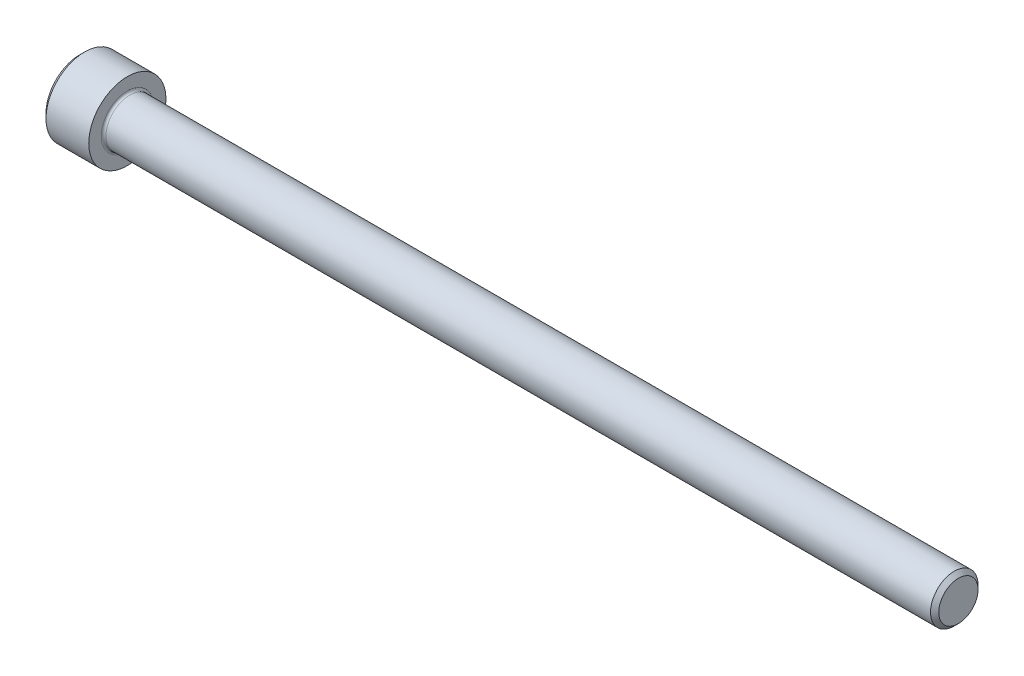
ISO-10303-21;
HEADER;
FILE_DESCRIPTION(('STEP AP214'),'2;1');
FILE_NAME('part.step','',(''),(''),'','','');
FILE_SCHEMA(('AUTOMOTIVE_DESIGN { 1 0 10303 214 1 1 1 1 }'));
ENDSEC;
DATA;
#1=APPLICATION_CONTEXT('core data for automotive mechanical design processes');
#2=APPLICATION_PROTOCOL_DEFINITION('international standard','automotive_design',2000,#1);
#3=PRODUCT_CONTEXT('',#1,'mechanical');
#4=PRODUCT('Part','Part','',(#3));
#5=PRODUCT_RELATED_PRODUCT_CATEGORY('part','',(#4));
#6=PRODUCT_DEFINITION_FORMATION('','',#4);
#7=PRODUCT_DEFINITION_CONTEXT('part definition',#1,'design');
#8=PRODUCT_DEFINITION('design','',#6,#7);
#9=PRODUCT_DEFINITION_SHAPE('','',#8);
#10=(LENGTH_UNIT() NAMED_UNIT(*) SI_UNIT(.MILLI.,.METRE.));
#11=(NAMED_UNIT(*) PLANE_ANGLE_UNIT() SI_UNIT($,.RADIAN.));
#12=(NAMED_UNIT(*) SI_UNIT($,.STERADIAN.) SOLID_ANGLE_UNIT());
#13=UNCERTAINTY_MEASURE_WITH_UNIT(LENGTH_MEASURE(1.E-05),#10,'distance_accuracy_value','');
#14=(GEOMETRIC_REPRESENTATION_CONTEXT(3) GLOBAL_UNCERTAINTY_ASSIGNED_CONTEXT((#13)) GLOBAL_UNIT_ASSIGNED_CONTEXT((#10,
#11,#12)) REPRESENTATION_CONTEXT('',''));
#15=CARTESIAN_POINT('',(0.,0.,0.));
#16=DIRECTION('',(0.,0.,1.));
#17=DIRECTION('',(1.,0.,0.));
#18=AXIS2_PLACEMENT_3D('',#15,#16,#17);
#19=CARTESIAN_POINT('',(0.,0.,0.));
#20=DIRECTION('',(-1.,0.,0.));
#21=DIRECTION('',(0.,0.,1.));
#22=AXIS2_PLACEMENT_3D('',#19,#20,#21);
#23=PLANE('',#22);
#24=DIRECTION('',(0.,-0.5,0.866025403784439));
#25=VECTOR('',#24,1.);
#26=CARTESIAN_POINT('',(0.,3.51894989071077,0.));
#27=LINE('',#26,#25);
#28=CARTESIAN_POINT('',(0.,3.51894989071077,0.));
#29=VERTEX_POINT('',#28);
#30=CARTESIAN_POINT('',(0.,1.75947494535539,3.0475));
#31=VERTEX_POINT('',#30);
#32=EDGE_CURVE('E267',#29,#31,#27,.T.);
#33=ORIENTED_EDGE('',*,*,#32,.T.);
#34=DIRECTION('',(0.,1.,0.));
#35=VECTOR('',#34,1.);
#36=CARTESIAN_POINT('',(0.,-1.75947494535538,3.0475));
#37=LINE('',#36,#35);
#38=CARTESIAN_POINT('',(0.,-1.75947494535538,3.0475));
#39=VERTEX_POINT('',#38);
#40=EDGE_CURVE('E137',#39,#31,#37,.T.);
#41=ORIENTED_EDGE('',*,*,#40,.F.);
#42=DIRECTION('',(0.,-0.500000000000001,-0.866025403784438));
#43=VECTOR('',#42,1.);
#44=CARTESIAN_POINT('',(0.,-1.75947494535538,3.0475));
#45=LINE('',#44,#43);
#46=CARTESIAN_POINT('',(0.,-3.51894989071077,0.));
#47=VERTEX_POINT('',#46);
#48=EDGE_CURVE('E270',#39,#47,#45,.T.);
#49=ORIENTED_EDGE('',*,*,#48,.T.);
#50=DIRECTION('',(0.,0.5,-0.866025403784439));
#51=VECTOR('',#50,1.);
#52=CARTESIAN_POINT('',(0.,-3.51894989071077,0.));
#53=LINE('',#52,#51);
#54=CARTESIAN_POINT('',(0.,-1.75947494535539,-3.0475));
#55=VERTEX_POINT('',#54);
#56=EDGE_CURVE('E271',#47,#55,#53,.T.);
#57=ORIENTED_EDGE('',*,*,#56,.T.);
#58=DIRECTION('',(0.,-1.,0.));
#59=VECTOR('',#58,1.);
#60=CARTESIAN_POINT('',(0.,1.75947494535538,-3.0475));
#61=LINE('',#60,#59);
#62=CARTESIAN_POINT('',(0.,1.75947494535538,-3.0475));
#63=VERTEX_POINT('',#62);
#64=EDGE_CURVE('E278',#63,#55,#61,.T.);
#65=ORIENTED_EDGE('',*,*,#64,.F.);
#66=DIRECTION('',(0.,-0.500000000000001,-0.866025403784438));
#67=VECTOR('',#66,1.);
#68=CARTESIAN_POINT('',(0.,3.51894989071077,0.));
#69=LINE('',#68,#67);
#70=EDGE_CURVE('E134',#29,#63,#69,.T.);
#71=ORIENTED_EDGE('',*,*,#70,.F.);
#72=EDGE_LOOP('',(#33,#41,#49,#57,#65,#71));
#73=FACE_BOUND('',#72,.T.);
#74=CARTESIAN_POINT('',(0.,0.,0.));
#75=DIRECTION('',(-1.,0.,0.));
#76=DIRECTION('',(0.,0.,1.));
#77=AXIS2_PLACEMENT_3D('',#74,#75,#76);
#78=CIRCLE('',#77,5.7);
#79=CARTESIAN_POINT('',(0.,0.,5.7));
#80=VERTEX_POINT('',#79);
#81=EDGE_CURVE('E163',#80,#80,#78,.T.);
#82=ORIENTED_EDGE('',*,*,#81,.T.);
#83=EDGE_LOOP('',(#82));
#84=FACE_BOUND('',#83,.T.);
#85=ADVANCED_FACE('F41',(#73,#84),#23,.T.);
#86=CARTESIAN_POINT('',(0.,0.,0.));
#87=DIRECTION('',(1.,0.,0.));
#88=DIRECTION('',(0.,0.,-1.));
#89=AXIS2_PLACEMENT_3D('',#86,#87,#88);
#90=CONICAL_SURFACE('',#89,5.7,0.785398163397448);
#91=CARTESIAN_POINT('',(0.800000000000002,0.,0.));
#92=DIRECTION('',(-1.,0.,0.));
#93=DIRECTION('',(0.,0.,1.));
#94=AXIS2_PLACEMENT_3D('',#91,#92,#93);
#95=CIRCLE('',#94,6.5);
#96=CARTESIAN_POINT('',(0.800000000000002,0.,6.5));
#97=VERTEX_POINT('',#96);
#98=EDGE_CURVE('E159',#97,#97,#95,.T.);
#99=ORIENTED_EDGE('',*,*,#98,.T.);
#100=EDGE_LOOP('',(#99));
#101=FACE_BOUND('',#100,.T.);
#102=ORIENTED_EDGE('',*,*,#81,.F.);
#103=EDGE_LOOP('',(#102));
#104=FACE_BOUND('',#103,.T.);
#105=ADVANCED_FACE('F182',(#101,#104),#90,.T.);
#106=CARTESIAN_POINT('',(-31.75,0.,0.));
#107=DIRECTION('',(-1.,0.,0.));
#108=DIRECTION('',(0.,0.,1.));
#109=AXIS2_PLACEMENT_3D('',#106,#107,#108);
#110=CYLINDRICAL_SURFACE('',#109,6.5);
#111=CARTESIAN_POINT('',(8.,0.,0.));
#112=DIRECTION('',(-1.,0.,0.));
#113=DIRECTION('',(0.,0.,1.));
#114=AXIS2_PLACEMENT_3D('',#111,#112,#113);
#115=CIRCLE('',#114,6.5);
#116=CARTESIAN_POINT('',(8.,0.,6.5));
#117=VERTEX_POINT('',#116);
#118=EDGE_CURVE('E153',#117,#117,#115,.T.);
#119=ORIENTED_EDGE('',*,*,#118,.T.);
#120=EDGE_LOOP('',(#119));
#121=FACE_BOUND('',#120,.T.);
#122=ORIENTED_EDGE('',*,*,#98,.F.);
#123=EDGE_LOOP('',(#122));
#124=FACE_BOUND('',#123,.T.);
#125=ADVANCED_FACE('F189',(#121,#124),#110,.T.);
#126=CARTESIAN_POINT('',(8.,6.5,0.));
#127=DIRECTION('',(1.,0.,0.));
#128=DIRECTION('',(0.,0.,-1.));
#129=AXIS2_PLACEMENT_3D('',#126,#127,#128);
#130=PLANE('',#129);
#131=CARTESIAN_POINT('',(8.,0.,0.));
#132=DIRECTION('',(1.,0.,0.));
#133=DIRECTION('',(0.,0.,-1.));
#134=AXIS2_PLACEMENT_3D('',#131,#132,#133);
#135=CIRCLE('',#134,4.40000000000002);
#136=CARTESIAN_POINT('',(8.,0.,-4.40000000000002));
#137=VERTEX_POINT('',#136);
#138=EDGE_CURVE('E47',#137,#137,#135,.F.);
#139=ORIENTED_EDGE('',*,*,#138,.T.);
#140=EDGE_LOOP('',(#139));
#141=FACE_BOUND('',#140,.T.);
#142=ORIENTED_EDGE('',*,*,#118,.F.);
#143=EDGE_LOOP('',(#142));
#144=FACE_BOUND('',#143,.T.);
#145=ADVANCED_FACE('F168',(#141,#144),#130,.T.);
#146=CARTESIAN_POINT('',(-31.75,0.,0.));
#147=DIRECTION('',(-1.,0.,0.));
#148=DIRECTION('',(0.,0.,1.));
#149=AXIS2_PLACEMENT_3D('',#146,#147,#148);
#150=CYLINDRICAL_SURFACE('',#149,4.00000000000002);
#151=CARTESIAN_POINT('',(8.4,0.,0.));
#152=DIRECTION('',(1.,0.,0.));
#153=DIRECTION('',(0.,0.,-1.));
#154=AXIS2_PLACEMENT_3D('',#151,#152,#153);
#155=CIRCLE('',#154,4.00000000000002);
#156=CARTESIAN_POINT('',(8.4,0.,-4.00000000000002));
#157=VERTEX_POINT('',#156);
#158=EDGE_CURVE('E11',#157,#157,#155,.T.);
#159=ORIENTED_EDGE('',*,*,#158,.T.);
#160=EDGE_LOOP('',(#159));
#161=FACE_BOUND('',#160,.T.);
#162=CARTESIAN_POINT('',(147.3095,0.,0.));
#163=DIRECTION('',(-1.,0.,0.));
#164=DIRECTION('',(0.,0.,1.));
#165=AXIS2_PLACEMENT_3D('',#162,#163,#164);
#166=CIRCLE('',#165,4.00000000000003);
#167=CARTESIAN_POINT('',(147.3095,0.,4.00000000000003));
#168=VERTEX_POINT('',#167);
#169=EDGE_CURVE('E154',#168,#168,#166,.T.);
#170=ORIENTED_EDGE('',*,*,#169,.T.);
#171=EDGE_LOOP('',(#170));
#172=FACE_BOUND('',#171,.T.);
#173=ADVANCED_FACE('F200',(#161,#172),#150,.T.);
#174=CARTESIAN_POINT('',(148.,0.,0.));
#175=DIRECTION('',(-1.,0.,0.));
#176=DIRECTION('',(0.,0.,1.));
#177=AXIS2_PLACEMENT_3D('',#174,#175,#176);
#178=CONICAL_SURFACE('',#177,3.3095,0.785398163397563);
#179=ORIENTED_EDGE('',*,*,#169,.F.);
#180=EDGE_LOOP('',(#179));
#181=FACE_BOUND('',#180,.T.);
#182=CARTESIAN_POINT('',(148.,0.,0.));
#183=DIRECTION('',(-1.,0.,0.));
#184=DIRECTION('',(0.,0.,1.));
#185=AXIS2_PLACEMENT_3D('',#182,#183,#184);
#186=CIRCLE('',#185,3.3095);
#187=CARTESIAN_POINT('',(148.,0.,3.3095));
#188=VERTEX_POINT('',#187);
#189=EDGE_CURVE('E146',#188,#188,#186,.T.);
#190=ORIENTED_EDGE('',*,*,#189,.T.);
#191=EDGE_LOOP('',(#190));
#192=FACE_BOUND('',#191,.T.);
#193=ADVANCED_FACE('F177',(#181,#192),#178,.T.);
#194=CARTESIAN_POINT('',(148.,3.3095,0.));
#195=DIRECTION('',(1.,0.,0.));
#196=DIRECTION('',(0.,0.,-1.));
#197=AXIS2_PLACEMENT_3D('',#194,#195,#196);
#198=PLANE('',#197);
#199=ORIENTED_EDGE('',*,*,#189,.F.);
#200=EDGE_LOOP('',(#199));
#201=FACE_BOUND('',#200,.T.);
#202=ADVANCED_FACE('F167',(#201),#198,.T.);
#203=CARTESIAN_POINT('',(8.4,0.,0.));
#204=DIRECTION('',(1.,0.,0.));
#205=DIRECTION('',(0.,0.,-1.));
#206=AXIS2_PLACEMENT_3D('',#203,#204,#205);
#207=TOROIDAL_SURFACE('',#206,4.40000000000002,0.4);
#208=ORIENTED_EDGE('',*,*,#158,.F.);
#209=EDGE_LOOP('',(#208));
#210=FACE_BOUND('',#209,.T.);
#211=ORIENTED_EDGE('',*,*,#138,.F.);
#212=EDGE_LOOP('',(#211));
#213=FACE_BOUND('',#212,.T.);
#214=ADVANCED_FACE('F43',(#210,#213),#207,.F.);
#215=CARTESIAN_POINT('',(4.,3.51894989071077,0.));
#216=DIRECTION('',(0.,-0.866025403784439,-0.5));
#217=DIRECTION('',(0.,0.5,-0.866025403784439));
#218=AXIS2_PLACEMENT_3D('',#215,#216,#217);
#219=PLANE('',#218);
#220=ORIENTED_EDGE('',*,*,#32,.F.);
#221=DIRECTION('',(-1.,0.,0.));
#222=VECTOR('',#221,1.);
#223=CARTESIAN_POINT('',(4.,3.51894989071077,0.));
#224=LINE('',#223,#222);
#225=CARTESIAN_POINT('',(4.,3.51894989071077,0.));
#226=VERTEX_POINT('',#225);
#227=EDGE_CURVE('E260',#226,#29,#224,.T.);
#228=ORIENTED_EDGE('',*,*,#227,.F.);
#229=DIRECTION('',(0.,-0.5,0.866025403784439));
#230=VECTOR('',#229,1.);
#231=CARTESIAN_POINT('',(4.,3.51894989071077,0.));
#232=LINE('',#231,#230);
#233=CARTESIAN_POINT('',(4.,2.63921241803308,1.52375));
#234=VERTEX_POINT('',#233);
#235=EDGE_CURVE('E121',#226,#234,#232,.T.);
#236=ORIENTED_EDGE('',*,*,#235,.T.);
#237=CARTESIAN_POINT('',(4.,1.75947494535539,3.0475));
#238=VERTEX_POINT('',#237);
#239=EDGE_CURVE('E114',#234,#238,#232,.T.);
#240=ORIENTED_EDGE('',*,*,#239,.T.);
#241=DIRECTION('',(-1.,0.,0.));
#242=VECTOR('',#241,1.);
#243=CARTESIAN_POINT('',(4.,1.75947494535539,3.0475));
#244=LINE('',#243,#242);
#245=EDGE_CURVE('E129',#238,#31,#244,.T.);
#246=ORIENTED_EDGE('',*,*,#245,.T.);
#247=EDGE_LOOP('',(#220,#228,#236,#240,#246));
#248=FACE_BOUND('',#247,.T.);
#249=ADVANCED_FACE('F126',(#248),#219,.T.);
#250=CARTESIAN_POINT('',(4.,-1.75947494535538,3.0475));
#251=DIRECTION('',(0.,0.,1.));
#252=DIRECTION('',(0.,-1.,0.));
#253=AXIS2_PLACEMENT_3D('',#250,#251,#252);
#254=PLANE('',#253);
#255=ORIENTED_EDGE('',*,*,#40,.T.);
#256=ORIENTED_EDGE('',*,*,#245,.F.);
#257=DIRECTION('',(0.,1.,0.));
#258=VECTOR('',#257,1.);
#259=CARTESIAN_POINT('',(4.,-1.75947494535538,3.0475));
#260=LINE('',#259,#258);
#261=CARTESIAN_POINT('',(4.,0.,3.0475));
#262=VERTEX_POINT('',#261);
#263=EDGE_CURVE('E115',#262,#238,#260,.T.);
#264=ORIENTED_EDGE('',*,*,#263,.F.);
#265=CARTESIAN_POINT('',(4.,-1.75947494535538,3.0475));
#266=VERTEX_POINT('',#265);
#267=EDGE_CURVE('E124',#266,#262,#260,.T.);
#268=ORIENTED_EDGE('',*,*,#267,.F.);
#269=DIRECTION('',(-1.,0.,0.));
#270=VECTOR('',#269,1.);
#271=CARTESIAN_POINT('',(4.,-1.75947494535538,3.0475));
#272=LINE('',#271,#270);
#273=EDGE_CURVE('E138',#266,#39,#272,.T.);
#274=ORIENTED_EDGE('',*,*,#273,.T.);
#275=EDGE_LOOP('',(#255,#256,#264,#268,#274));
#276=FACE_BOUND('',#275,.T.);
#277=ADVANCED_FACE('F131',(#276),#254,.F.);
#278=CARTESIAN_POINT('',(4.,-1.75947494535538,3.0475));
#279=DIRECTION('',(0.,0.866025403784438,-0.500000000000001));
#280=DIRECTION('',(0.,0.500000000000001,0.866025403784438));
#281=AXIS2_PLACEMENT_3D('',#278,#279,#280);
#282=PLANE('',#281);
#283=ORIENTED_EDGE('',*,*,#48,.F.);
#284=ORIENTED_EDGE('',*,*,#273,.F.);
#285=DIRECTION('',(0.,-0.500000000000001,-0.866025403784438));
#286=VECTOR('',#285,1.);
#287=CARTESIAN_POINT('',(4.,-1.75947494535538,3.0475));
#288=LINE('',#287,#286);
#289=CARTESIAN_POINT('',(4.,-2.63921241803308,1.52375));
#290=VERTEX_POINT('',#289);
#291=EDGE_CURVE('E298',#266,#290,#288,.T.);
#292=ORIENTED_EDGE('',*,*,#291,.T.);
#293=CARTESIAN_POINT('',(4.,-3.51894989071077,0.));
#294=VERTEX_POINT('',#293);
#295=EDGE_CURVE('E283',#290,#294,#288,.T.);
#296=ORIENTED_EDGE('',*,*,#295,.T.);
#297=DIRECTION('',(-1.,0.,0.));
#298=VECTOR('',#297,1.);
#299=CARTESIAN_POINT('',(4.,-3.51894989071077,0.));
#300=LINE('',#299,#298);
#301=EDGE_CURVE('E144',#294,#47,#300,.T.);
#302=ORIENTED_EDGE('',*,*,#301,.T.);
#303=EDGE_LOOP('',(#283,#284,#292,#296,#302));
#304=FACE_BOUND('',#303,.T.);
#305=ADVANCED_FACE('F213',(#304),#282,.T.);
#306=CARTESIAN_POINT('',(4.,-3.51894989071077,0.));
#307=DIRECTION('',(0.,0.866025403784439,0.5));
#308=DIRECTION('',(0.,-0.5,0.866025403784439));
#309=AXIS2_PLACEMENT_3D('',#306,#307,#308);
#310=PLANE('',#309);
#311=ORIENTED_EDGE('',*,*,#56,.F.);
#312=ORIENTED_EDGE('',*,*,#301,.F.);
#313=DIRECTION('',(0.,0.5,-0.866025403784439));
#314=VECTOR('',#313,1.);
#315=CARTESIAN_POINT('',(4.,-3.51894989071077,0.));
#316=LINE('',#315,#314);
#317=CARTESIAN_POINT('',(4.,-2.63921241803308,-1.52375));
#318=VERTEX_POINT('',#317);
#319=EDGE_CURVE('E265',#294,#318,#316,.T.);
#320=ORIENTED_EDGE('',*,*,#319,.T.);
#321=CARTESIAN_POINT('',(4.,-1.75947494535539,-3.0475));
#322=VERTEX_POINT('',#321);
#323=EDGE_CURVE('E294',#318,#322,#316,.T.);
#324=ORIENTED_EDGE('',*,*,#323,.T.);
#325=DIRECTION('',(-1.,0.,0.));
#326=VECTOR('',#325,1.);
#327=CARTESIAN_POINT('',(4.,-1.75947494535539,-3.0475));
#328=LINE('',#327,#326);
#329=EDGE_CURVE('E258',#322,#55,#328,.T.);
#330=ORIENTED_EDGE('',*,*,#329,.T.);
#331=EDGE_LOOP('',(#311,#312,#320,#324,#330));
#332=FACE_BOUND('',#331,.T.);
#333=ADVANCED_FACE('F214',(#332),#310,.T.);
#334=CARTESIAN_POINT('',(4.,1.75947494535538,-3.0475));
#335=DIRECTION('',(0.,0.,-1.));
#336=DIRECTION('',(0.,1.,0.));
#337=AXIS2_PLACEMENT_3D('',#334,#335,#336);
#338=PLANE('',#337);
#339=ORIENTED_EDGE('',*,*,#64,.T.);
#340=ORIENTED_EDGE('',*,*,#329,.F.);
#341=DIRECTION('',(0.,-1.,0.));
#342=VECTOR('',#341,1.);
#343=CARTESIAN_POINT('',(4.,1.75947494535538,-3.0475));
#344=LINE('',#343,#342);
#345=CARTESIAN_POINT('',(4.,0.,-3.0475));
#346=VERTEX_POINT('',#345);
#347=EDGE_CURVE('E257',#346,#322,#344,.T.);
#348=ORIENTED_EDGE('',*,*,#347,.F.);
#349=CARTESIAN_POINT('',(4.,1.75947494535538,-3.0475));
#350=VERTEX_POINT('',#349);
#351=EDGE_CURVE('E57',#350,#346,#344,.T.);
#352=ORIENTED_EDGE('',*,*,#351,.F.);
#353=DIRECTION('',(-1.,0.,0.));
#354=VECTOR('',#353,1.);
#355=CARTESIAN_POINT('',(4.,1.75947494535538,-3.0475));
#356=LINE('',#355,#354);
#357=EDGE_CURVE('E254',#350,#63,#356,.T.);
#358=ORIENTED_EDGE('',*,*,#357,.T.);
#359=EDGE_LOOP('',(#339,#340,#348,#352,#358));
#360=FACE_BOUND('',#359,.T.);
#361=ADVANCED_FACE('F220',(#360),#338,.F.);
#362=CARTESIAN_POINT('',(4.,3.51894989071077,0.));
#363=DIRECTION('',(0.,0.866025403784438,-0.500000000000001));
#364=DIRECTION('',(0.,0.500000000000001,0.866025403784438));
#365=AXIS2_PLACEMENT_3D('',#362,#363,#364);
#366=PLANE('',#365);
#367=ORIENTED_EDGE('',*,*,#70,.T.);
#368=ORIENTED_EDGE('',*,*,#357,.F.);
#369=DIRECTION('',(0.,-0.500000000000001,-0.866025403784438));
#370=VECTOR('',#369,1.);
#371=CARTESIAN_POINT('',(4.,3.51894989071077,0.));
#372=LINE('',#371,#370);
#373=CARTESIAN_POINT('',(4.,2.63921241803307,-1.52375));
#374=VERTEX_POINT('',#373);
#375=EDGE_CURVE('E243',#374,#350,#372,.T.);
#376=ORIENTED_EDGE('',*,*,#375,.F.);
#377=EDGE_CURVE('E248',#226,#374,#372,.T.);
#378=ORIENTED_EDGE('',*,*,#377,.F.);
#379=ORIENTED_EDGE('',*,*,#227,.T.);
#380=EDGE_LOOP('',(#367,#368,#376,#378,#379));
#381=FACE_BOUND('',#380,.T.);
#382=ADVANCED_FACE('F222',(#381),#366,.F.);
#383=CARTESIAN_POINT('',(4.,3.51894989071077,0.));
#384=DIRECTION('',(1.,0.,0.));
#385=DIRECTION('',(0.,0.,-1.));
#386=AXIS2_PLACEMENT_3D('',#383,#384,#385);
#387=PLANE('',#386);
#388=ORIENTED_EDGE('',*,*,#347,.T.);
#389=ORIENTED_EDGE('',*,*,#323,.F.);
#390=CARTESIAN_POINT('',(4.,0.,0.));
#391=DIRECTION('',(-1.,0.,0.));
#392=DIRECTION('',(0.,0.,1.));
#393=AXIS2_PLACEMENT_3D('',#390,#391,#392);
#394=CIRCLE('',#393,3.0475);
#395=EDGE_CURVE('E293',#346,#318,#394,.T.);
#396=ORIENTED_EDGE('',*,*,#395,.F.);
#397=EDGE_LOOP('',(#388,#389,#396));
#398=FACE_BOUND('',#397,.T.);
#399=ADVANCED_FACE('F228',(#398),#387,.F.);
#400=ORIENTED_EDGE('',*,*,#319,.F.);
#401=ORIENTED_EDGE('',*,*,#295,.F.);
#402=EDGE_CURVE('E145',#318,#290,#394,.T.);
#403=ORIENTED_EDGE('',*,*,#402,.F.);
#404=EDGE_LOOP('',(#400,#401,#403));
#405=FACE_BOUND('',#404,.T.);
#406=ADVANCED_FACE('F230',(#405),#387,.F.);
#407=ORIENTED_EDGE('',*,*,#291,.F.);
#408=ORIENTED_EDGE('',*,*,#267,.T.);
#409=EDGE_CURVE('E139',#290,#262,#394,.T.);
#410=ORIENTED_EDGE('',*,*,#409,.F.);
#411=EDGE_LOOP('',(#407,#408,#410));
#412=FACE_BOUND('',#411,.T.);
#413=ADVANCED_FACE('F234',(#412),#387,.F.);
#414=ORIENTED_EDGE('',*,*,#263,.T.);
#415=ORIENTED_EDGE('',*,*,#239,.F.);
#416=EDGE_CURVE('E117',#262,#234,#394,.T.);
#417=ORIENTED_EDGE('',*,*,#416,.F.);
#418=EDGE_LOOP('',(#414,#415,#417));
#419=FACE_BOUND('',#418,.T.);
#420=ADVANCED_FACE('F112',(#419),#387,.F.);
#421=ORIENTED_EDGE('',*,*,#235,.F.);
#422=ORIENTED_EDGE('',*,*,#377,.T.);
#423=EDGE_CURVE('E149',#234,#374,#394,.T.);
#424=ORIENTED_EDGE('',*,*,#423,.F.);
#425=EDGE_LOOP('',(#421,#422,#424));
#426=FACE_BOUND('',#425,.T.);
#427=ADVANCED_FACE('F240',(#426),#387,.F.);
#428=ORIENTED_EDGE('',*,*,#375,.T.);
#429=ORIENTED_EDGE('',*,*,#351,.T.);
#430=EDGE_CURVE('E246',#374,#346,#394,.T.);
#431=ORIENTED_EDGE('',*,*,#430,.F.);
#432=EDGE_LOOP('',(#428,#429,#431));
#433=FACE_BOUND('',#432,.T.);
#434=ADVANCED_FACE('F210',(#433),#387,.F.);
#435=CARTESIAN_POINT('',(4.,0.,0.));
#436=DIRECTION('',(-1.,0.,0.));
#437=DIRECTION('',(0.,0.,1.));
#438=AXIS2_PLACEMENT_3D('',#435,#436,#437);
#439=CONICAL_SURFACE('',#438,3.0475,1.04719755119659);
#440=CARTESIAN_POINT('',(5.75947494535541,0.,0.));
#441=VERTEX_POINT('',#440);
#442=VERTEX_LOOP('',#441);
#443=FACE_BOUND('',#442,.T.);
#444=ORIENTED_EDGE('',*,*,#416,.T.);
#445=ORIENTED_EDGE('',*,*,#423,.T.);
#446=ORIENTED_EDGE('',*,*,#430,.T.);
#447=ORIENTED_EDGE('',*,*,#395,.T.);
#448=ORIENTED_EDGE('',*,*,#402,.T.);
#449=ORIENTED_EDGE('',*,*,#409,.T.);
#450=EDGE_LOOP('',(#444,#445,#446,#447,#448,#449));
#451=FACE_BOUND('',#450,.T.);
#452=ADVANCED_FACE('F205',(#443,#451),#439,.F.);
#453=CLOSED_SHELL('',(#85,#105,#125,#145,#173,#193,#202,#214,#249,#277,#305,#333,#361,#382,#399,
#406,#413,#420,#427,#434,#452));
#454=MANIFOLD_SOLID_BREP('B2',#453);
#455=ADVANCED_BREP_SHAPE_REPRESENTATION('',(#18,#454),#14);
#456=SHAPE_DEFINITION_REPRESENTATION(#9,#455);
ENDSEC;
END-ISO-10303-21;
